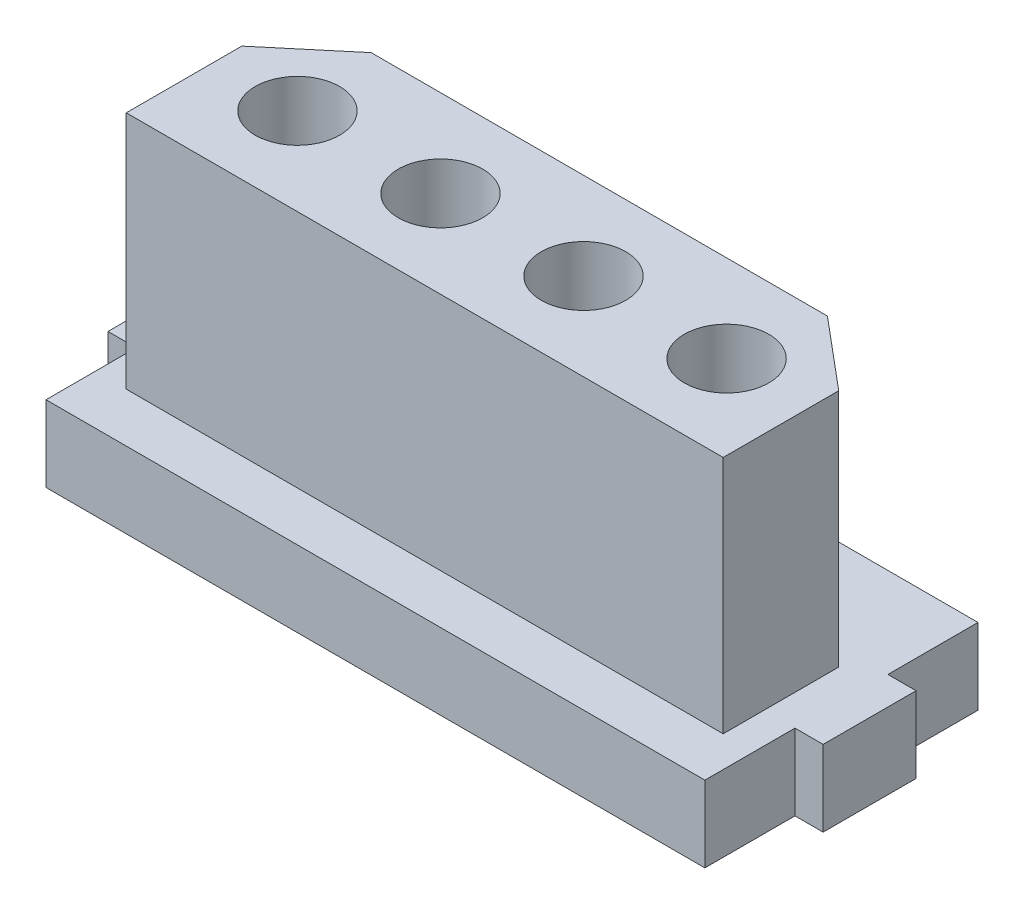
ISO-10303-21;
HEADER;
FILE_DESCRIPTION(('STEP AP214'),'2;1');
FILE_NAME('part.step','',(''),(''),'','','');
FILE_SCHEMA(('AUTOMOTIVE_DESIGN { 1 0 10303 214 1 1 1 1 }'));
ENDSEC;
DATA;
#1=APPLICATION_CONTEXT('core data for automotive mechanical design processes');
#2=APPLICATION_PROTOCOL_DEFINITION('international standard','automotive_design',2000,#1);
#3=PRODUCT_CONTEXT('',#1,'mechanical');
#4=PRODUCT('Part','Part','',(#3));
#5=PRODUCT_RELATED_PRODUCT_CATEGORY('part','',(#4));
#6=PRODUCT_DEFINITION_FORMATION('','',#4);
#7=PRODUCT_DEFINITION_CONTEXT('part definition',#1,'design');
#8=PRODUCT_DEFINITION('design','',#6,#7);
#9=PRODUCT_DEFINITION_SHAPE('','',#8);
#10=(LENGTH_UNIT() NAMED_UNIT(*) SI_UNIT(.MILLI.,.METRE.));
#11=(NAMED_UNIT(*) PLANE_ANGLE_UNIT() SI_UNIT($,.RADIAN.));
#12=(NAMED_UNIT(*) SI_UNIT($,.STERADIAN.) SOLID_ANGLE_UNIT());
#13=UNCERTAINTY_MEASURE_WITH_UNIT(LENGTH_MEASURE(1.E-05),#10,'distance_accuracy_value','');
#14=(GEOMETRIC_REPRESENTATION_CONTEXT(3) GLOBAL_UNCERTAINTY_ASSIGNED_CONTEXT((#13)) GLOBAL_UNIT_ASSIGNED_CONTEXT((#10,
#11,#12)) REPRESENTATION_CONTEXT('',''));
#15=CARTESIAN_POINT('',(0.,0.,0.));
#16=DIRECTION('',(0.,0.,1.));
#17=DIRECTION('',(1.,0.,0.));
#18=AXIS2_PLACEMENT_3D('',#15,#16,#17);
#19=CARTESIAN_POINT('',(0.,2.7,0.));
#20=DIRECTION('',(0.,1.,0.));
#21=DIRECTION('',(0.,0.,1.));
#22=AXIS2_PLACEMENT_3D('',#19,#20,#21);
#23=PLANE('',#22);
#24=CARTESIAN_POINT('',(7.62,2.7,0.));
#25=DIRECTION('',(0.,1.,0.));
#26=DIRECTION('',(0.,0.,1.));
#27=AXIS2_PLACEMENT_3D('',#24,#25,#26);
#28=CIRCLE('',#27,1.5);
#29=CARTESIAN_POINT('',(7.62,2.7,1.5));
#30=VERTEX_POINT('',#29);
#31=EDGE_CURVE('E20',#30,#30,#28,.T.);
#32=ORIENTED_EDGE('',*,*,#31,.T.);
#33=EDGE_LOOP('',(#32));
#34=FACE_BOUND('',#33,.T.);
#35=ADVANCED_FACE('F17',(#34),#23,.T.);
#36=CARTESIAN_POINT('',(0.,2.7,0.));
#37=DIRECTION('',(0.,1.,0.));
#38=DIRECTION('',(0.,0.,1.));
#39=AXIS2_PLACEMENT_3D('',#36,#37,#38);
#40=PLANE('',#39);
#41=CARTESIAN_POINT('',(2.54,2.7,0.));
#42=DIRECTION('',(0.,1.,0.));
#43=DIRECTION('',(0.,0.,1.));
#44=AXIS2_PLACEMENT_3D('',#41,#42,#43);
#45=CIRCLE('',#44,1.5);
#46=CARTESIAN_POINT('',(2.54,2.7,1.5));
#47=VERTEX_POINT('',#46);
#48=EDGE_CURVE('E183',#47,#47,#45,.T.);
#49=ORIENTED_EDGE('',*,*,#48,.T.);
#50=EDGE_LOOP('',(#49));
#51=FACE_BOUND('',#50,.T.);
#52=ADVANCED_FACE('F459',(#51),#40,.T.);
#53=CARTESIAN_POINT('',(0.,2.7,0.));
#54=DIRECTION('',(0.,1.,0.));
#55=DIRECTION('',(0.,0.,1.));
#56=AXIS2_PLACEMENT_3D('',#53,#54,#55);
#57=PLANE('',#56);
#58=CARTESIAN_POINT('',(-2.54,2.7,0.));
#59=DIRECTION('',(0.,1.,0.));
#60=DIRECTION('',(0.,0.,1.));
#61=AXIS2_PLACEMENT_3D('',#58,#59,#60);
#62=CIRCLE('',#61,1.5);
#63=CARTESIAN_POINT('',(-2.54,2.7,1.5));
#64=VERTEX_POINT('',#63);
#65=EDGE_CURVE('E181',#64,#64,#62,.T.);
#66=ORIENTED_EDGE('',*,*,#65,.T.);
#67=EDGE_LOOP('',(#66));
#68=FACE_BOUND('',#67,.T.);
#69=ADVANCED_FACE('F450',(#68),#57,.T.);
#70=CARTESIAN_POINT('',(0.,2.7,0.));
#71=DIRECTION('',(0.,1.,0.));
#72=DIRECTION('',(0.,0.,1.));
#73=AXIS2_PLACEMENT_3D('',#70,#71,#72);
#74=PLANE('',#73);
#75=CARTESIAN_POINT('',(-7.62,2.7,0.));
#76=DIRECTION('',(0.,1.,0.));
#77=DIRECTION('',(0.,0.,1.));
#78=AXIS2_PLACEMENT_3D('',#75,#76,#77);
#79=CIRCLE('',#78,1.5);
#80=CARTESIAN_POINT('',(-7.62,2.7,1.5));
#81=VERTEX_POINT('',#80);
#82=EDGE_CURVE('E178',#81,#81,#79,.T.);
#83=ORIENTED_EDGE('',*,*,#82,.T.);
#84=EDGE_LOOP('',(#83));
#85=FACE_BOUND('',#84,.T.);
#86=ADVANCED_FACE('F195',(#85),#74,.T.);
#87=CARTESIAN_POINT('',(7.62,11.2,0.));
#88=DIRECTION('',(0.,1.,0.));
#89=DIRECTION('',(0.,0.,1.));
#90=AXIS2_PLACEMENT_3D('',#87,#88,#89);
#91=CYLINDRICAL_SURFACE('',#90,1.5);
#92=ORIENTED_EDGE('',*,*,#31,.F.);
#93=EDGE_LOOP('',(#92));
#94=FACE_BOUND('',#93,.T.);
#95=CARTESIAN_POINT('',(7.62,11.2,0.));
#96=DIRECTION('',(0.,1.,0.));
#97=DIRECTION('',(0.,0.,1.));
#98=AXIS2_PLACEMENT_3D('',#95,#96,#97);
#99=CIRCLE('',#98,1.5);
#100=CARTESIAN_POINT('',(7.62,11.2,1.5));
#101=VERTEX_POINT('',#100);
#102=EDGE_CURVE('E175',#101,#101,#99,.F.);
#103=ORIENTED_EDGE('',*,*,#102,.F.);
#104=EDGE_LOOP('',(#103));
#105=FACE_BOUND('',#104,.T.);
#106=ADVANCED_FACE('F191',(#94,#105),#91,.F.);
#107=CARTESIAN_POINT('',(2.54,11.2,0.));
#108=DIRECTION('',(0.,1.,0.));
#109=DIRECTION('',(0.,0.,1.));
#110=AXIS2_PLACEMENT_3D('',#107,#108,#109);
#111=CYLINDRICAL_SURFACE('',#110,1.5);
#112=ORIENTED_EDGE('',*,*,#48,.F.);
#113=EDGE_LOOP('',(#112));
#114=FACE_BOUND('',#113,.T.);
#115=CARTESIAN_POINT('',(2.54,11.2,0.));
#116=DIRECTION('',(0.,1.,0.));
#117=DIRECTION('',(0.,0.,1.));
#118=AXIS2_PLACEMENT_3D('',#115,#116,#117);
#119=CIRCLE('',#118,1.5);
#120=CARTESIAN_POINT('',(2.54,11.2,1.5));
#121=VERTEX_POINT('',#120);
#122=EDGE_CURVE('E172',#121,#121,#119,.F.);
#123=ORIENTED_EDGE('',*,*,#122,.F.);
#124=EDGE_LOOP('',(#123));
#125=FACE_BOUND('',#124,.T.);
#126=ADVANCED_FACE('F194',(#114,#125),#111,.F.);
#127=CARTESIAN_POINT('',(-2.54,11.2,0.));
#128=DIRECTION('',(0.,1.,0.));
#129=DIRECTION('',(0.,0.,1.));
#130=AXIS2_PLACEMENT_3D('',#127,#128,#129);
#131=CYLINDRICAL_SURFACE('',#130,1.5);
#132=ORIENTED_EDGE('',*,*,#65,.F.);
#133=EDGE_LOOP('',(#132));
#134=FACE_BOUND('',#133,.T.);
#135=CARTESIAN_POINT('',(-2.54,11.2,0.));
#136=DIRECTION('',(0.,1.,0.));
#137=DIRECTION('',(0.,0.,1.));
#138=AXIS2_PLACEMENT_3D('',#135,#136,#137);
#139=CIRCLE('',#138,1.5);
#140=CARTESIAN_POINT('',(-2.54,11.2,1.5));
#141=VERTEX_POINT('',#140);
#142=EDGE_CURVE('E169',#141,#141,#139,.F.);
#143=ORIENTED_EDGE('',*,*,#142,.F.);
#144=EDGE_LOOP('',(#143));
#145=FACE_BOUND('',#144,.T.);
#146=ADVANCED_FACE('F209',(#134,#145),#131,.F.);
#147=CARTESIAN_POINT('',(-7.62,11.2,0.));
#148=DIRECTION('',(0.,1.,0.));
#149=DIRECTION('',(0.,0.,1.));
#150=AXIS2_PLACEMENT_3D('',#147,#148,#149);
#151=CYLINDRICAL_SURFACE('',#150,1.5);
#152=ORIENTED_EDGE('',*,*,#82,.F.);
#153=EDGE_LOOP('',(#152));
#154=FACE_BOUND('',#153,.T.);
#155=CARTESIAN_POINT('',(-7.62,11.2,0.));
#156=DIRECTION('',(0.,1.,0.));
#157=DIRECTION('',(0.,0.,1.));
#158=AXIS2_PLACEMENT_3D('',#155,#156,#157);
#159=CIRCLE('',#158,1.5);
#160=CARTESIAN_POINT('',(-7.62,11.2,1.5));
#161=VERTEX_POINT('',#160);
#162=EDGE_CURVE('E155',#161,#161,#159,.F.);
#163=ORIENTED_EDGE('',*,*,#162,.F.);
#164=EDGE_LOOP('',(#163));
#165=FACE_BOUND('',#164,.T.);
#166=ADVANCED_FACE('F200',(#154,#165),#151,.F.);
#167=CARTESIAN_POINT('',(0.,11.2,0.));
#168=DIRECTION('',(0.,1.,0.));
#169=DIRECTION('',(0.,0.,1.));
#170=AXIS2_PLACEMENT_3D('',#167,#168,#169);
#171=PLANE('',#170);
#172=ORIENTED_EDGE('',*,*,#162,.T.);
#173=EDGE_LOOP('',(#172));
#174=FACE_BOUND('',#173,.T.);
#175=ORIENTED_EDGE('',*,*,#142,.T.);
#176=EDGE_LOOP('',(#175));
#177=FACE_BOUND('',#176,.T.);
#178=ORIENTED_EDGE('',*,*,#122,.T.);
#179=EDGE_LOOP('',(#178));
#180=FACE_BOUND('',#179,.T.);
#181=ORIENTED_EDGE('',*,*,#102,.T.);
#182=EDGE_LOOP('',(#181));
#183=FACE_BOUND('',#182,.T.);
#184=DIRECTION('',(0.,0.,1.));
#185=VECTOR('',#184,1.);
#186=CARTESIAN_POINT('',(10.6,11.2,-1.00385));
#187=LINE('',#186,#185);
#188=CARTESIAN_POINT('',(10.6,11.2,3.1));
#189=VERTEX_POINT('',#188);
#190=CARTESIAN_POINT('',(10.6000000000001,11.2,-1.00385000000007));
#191=VERTEX_POINT('',#190);
#192=EDGE_CURVE('E527',#189,#191,#187,.F.);
#193=ORIENTED_EDGE('',*,*,#192,.T.);
#194=DIRECTION('',(0.766044443119007,0.,0.642787609686505));
#195=VECTOR('',#194,1.);
#196=CARTESIAN_POINT('',(8.101905706884,11.2,-3.1));
#197=LINE('',#196,#195);
#198=CARTESIAN_POINT('',(8.101905706884,11.2,-3.1));
#199=VERTEX_POINT('',#198);
#200=EDGE_CURVE('E532',#191,#199,#197,.F.);
#201=ORIENTED_EDGE('',*,*,#200,.T.);
#202=DIRECTION('',(1.,0.,0.));
#203=VECTOR('',#202,1.);
#204=CARTESIAN_POINT('',(-8.101905706884,11.2,-3.1));
#205=LINE('',#204,#203);
#206=CARTESIAN_POINT('',(-8.10190570688394,11.2,-3.09999999999993));
#207=VERTEX_POINT('',#206);
#208=EDGE_CURVE('E536',#199,#207,#205,.F.);
#209=ORIENTED_EDGE('',*,*,#208,.T.);
#210=DIRECTION('',(0.766044443119007,0.,-0.642787609686505));
#211=VECTOR('',#210,1.);
#212=CARTESIAN_POINT('',(-10.6,11.2,-1.00385));
#213=LINE('',#212,#211);
#214=CARTESIAN_POINT('',(-10.6,11.2,-1.00385));
#215=VERTEX_POINT('',#214);
#216=EDGE_CURVE('E159',#207,#215,#213,.F.);
#217=ORIENTED_EDGE('',*,*,#216,.T.);
#218=DIRECTION('',(0.,0.,-1.));
#219=VECTOR('',#218,1.);
#220=CARTESIAN_POINT('',(-10.6,11.2,3.1));
#221=LINE('',#220,#219);
#222=CARTESIAN_POINT('',(-10.6,11.2,3.1));
#223=VERTEX_POINT('',#222);
#224=EDGE_CURVE('E140',#215,#223,#221,.F.);
#225=ORIENTED_EDGE('',*,*,#224,.T.);
#226=DIRECTION('',(-1.,0.,0.));
#227=VECTOR('',#226,1.);
#228=CARTESIAN_POINT('',(10.6,11.2,3.1));
#229=LINE('',#228,#227);
#230=EDGE_CURVE('E147',#223,#189,#229,.F.);
#231=ORIENTED_EDGE('',*,*,#230,.T.);
#232=EDGE_LOOP('',(#193,#201,#209,#217,#225,#231));
#233=FACE_BOUND('',#232,.T.);
#234=ADVANCED_FACE('F162',(#174,#177,#180,#183,#233),#171,.T.);
#235=CARTESIAN_POINT('',(10.6,11.2,3.1));
#236=DIRECTION('',(0.,0.,-1.));
#237=DIRECTION('',(-1.,0.,0.));
#238=AXIS2_PLACEMENT_3D('',#235,#236,#237);
#239=PLANE('',#238);
#240=DIRECTION('',(1.,0.,0.));
#241=VECTOR('',#240,1.);
#242=CARTESIAN_POINT('',(0.,2.7,3.1));
#243=LINE('',#242,#241);
#244=CARTESIAN_POINT('',(10.6,2.7,3.1));
#245=VERTEX_POINT('',#244);
#246=CARTESIAN_POINT('',(-10.6,2.7,3.1));
#247=VERTEX_POINT('',#246);
#248=EDGE_CURVE('E502',#245,#247,#243,.F.);
#249=ORIENTED_EDGE('',*,*,#248,.F.);
#250=DIRECTION('',(0.,1.,0.));
#251=VECTOR('',#250,1.);
#252=CARTESIAN_POINT('',(10.6,11.2,3.1));
#253=LINE('',#252,#251);
#254=EDGE_CURVE('E152',#245,#189,#253,.T.);
#255=ORIENTED_EDGE('',*,*,#254,.T.);
#256=ORIENTED_EDGE('',*,*,#230,.F.);
#257=DIRECTION('',(0.,1.,0.));
#258=VECTOR('',#257,1.);
#259=CARTESIAN_POINT('',(-10.6,11.2,3.1));
#260=LINE('',#259,#258);
#261=EDGE_CURVE('E150',#223,#247,#260,.F.);
#262=ORIENTED_EDGE('',*,*,#261,.T.);
#263=EDGE_LOOP('',(#249,#255,#256,#262));
#264=FACE_BOUND('',#263,.T.);
#265=ADVANCED_FACE('F149',(#264),#239,.F.);
#266=CARTESIAN_POINT('',(-10.6,11.2,3.1));
#267=DIRECTION('',(1.,0.,0.));
#268=DIRECTION('',(0.,0.,-1.));
#269=AXIS2_PLACEMENT_3D('',#266,#267,#268);
#270=PLANE('',#269);
#271=DIRECTION('',(0.,0.,1.));
#272=VECTOR('',#271,1.);
#273=CARTESIAN_POINT('',(-10.6,2.7,0.));
#274=LINE('',#273,#272);
#275=CARTESIAN_POINT('',(-10.6,2.7,-1.00385));
#276=VERTEX_POINT('',#275);
#277=EDGE_CURVE('E158',#247,#276,#274,.F.);
#278=ORIENTED_EDGE('',*,*,#277,.F.);
#279=ORIENTED_EDGE('',*,*,#261,.F.);
#280=ORIENTED_EDGE('',*,*,#224,.F.);
#281=DIRECTION('',(0.,1.,0.));
#282=VECTOR('',#281,1.);
#283=CARTESIAN_POINT('',(-10.6,11.2,-1.00385));
#284=LINE('',#283,#282);
#285=EDGE_CURVE('E494',#215,#276,#284,.F.);
#286=ORIENTED_EDGE('',*,*,#285,.T.);
#287=EDGE_LOOP('',(#278,#279,#280,#286));
#288=FACE_BOUND('',#287,.T.);
#289=ADVANCED_FACE('F157',(#288),#270,.F.);
#290=CARTESIAN_POINT('',(-10.6,11.2,-1.00385));
#291=DIRECTION('',(0.642787609686505,0.,0.766044443119007));
#292=DIRECTION('',(0.766044443119007,0.,-0.642787609686505));
#293=AXIS2_PLACEMENT_3D('',#290,#291,#292);
#294=PLANE('',#293);
#295=DIRECTION('',(0.766044443118933,0.,-0.642787609686593));
#296=VECTOR('',#295,1.);
#297=CARTESIAN_POINT('',(-10.6,2.7,-1.00385));
#298=LINE('',#297,#296);
#299=CARTESIAN_POINT('',(-8.10190570688388,2.7,-3.09999999999986));
#300=VERTEX_POINT('',#299);
#301=EDGE_CURVE('E493',#276,#300,#298,.T.);
#302=ORIENTED_EDGE('',*,*,#301,.F.);
#303=ORIENTED_EDGE('',*,*,#285,.F.);
#304=ORIENTED_EDGE('',*,*,#216,.F.);
#305=DIRECTION('',(0.,1.,0.));
#306=VECTOR('',#305,1.);
#307=CARTESIAN_POINT('',(-8.101905706884,11.2,-3.1));
#308=LINE('',#307,#306);
#309=EDGE_CURVE('E496',#207,#300,#308,.F.);
#310=ORIENTED_EDGE('',*,*,#309,.T.);
#311=EDGE_LOOP('',(#302,#303,#304,#310));
#312=FACE_BOUND('',#311,.T.);
#313=ADVANCED_FACE('F283',(#312),#294,.F.);
#314=CARTESIAN_POINT('',(-8.101905706884,11.2,-3.1));
#315=DIRECTION('',(0.,0.,1.));
#316=DIRECTION('',(1.,0.,0.));
#317=AXIS2_PLACEMENT_3D('',#314,#315,#316);
#318=PLANE('',#317);
#319=DIRECTION('',(1.,0.,0.));
#320=VECTOR('',#319,1.);
#321=CARTESIAN_POINT('',(0.,2.7,-3.1));
#322=LINE('',#321,#320);
#323=CARTESIAN_POINT('',(8.101905706884,2.7,-3.1));
#324=VERTEX_POINT('',#323);
#325=EDGE_CURVE('E498',#300,#324,#322,.T.);
#326=ORIENTED_EDGE('',*,*,#325,.F.);
#327=ORIENTED_EDGE('',*,*,#309,.F.);
#328=ORIENTED_EDGE('',*,*,#208,.F.);
#329=DIRECTION('',(0.,1.,0.));
#330=VECTOR('',#329,1.);
#331=CARTESIAN_POINT('',(8.101905706884,11.2,-3.1));
#332=LINE('',#331,#330);
#333=EDGE_CURVE('E529',#199,#324,#332,.F.);
#334=ORIENTED_EDGE('',*,*,#333,.T.);
#335=EDGE_LOOP('',(#326,#327,#328,#334));
#336=FACE_BOUND('',#335,.T.);
#337=ADVANCED_FACE('F279',(#336),#318,.F.);
#338=CARTESIAN_POINT('',(8.101905706884,11.2,-3.1));
#339=DIRECTION('',(-0.642787609686505,0.,0.766044443119007));
#340=DIRECTION('',(0.766044443119007,0.,0.642787609686505));
#341=AXIS2_PLACEMENT_3D('',#338,#339,#340);
#342=PLANE('',#341);
#343=DIRECTION('',(0.766044443118933,0.,0.642787609686593));
#344=VECTOR('',#343,1.);
#345=CARTESIAN_POINT('',(8.101905706884,2.7,-3.1));
#346=LINE('',#345,#344);
#347=CARTESIAN_POINT('',(10.6000000000001,2.7,-1.00385000000014));
#348=VERTEX_POINT('',#347);
#349=EDGE_CURVE('E500',#324,#348,#346,.T.);
#350=ORIENTED_EDGE('',*,*,#349,.F.);
#351=ORIENTED_EDGE('',*,*,#333,.F.);
#352=ORIENTED_EDGE('',*,*,#200,.F.);
#353=DIRECTION('',(0.,1.,0.));
#354=VECTOR('',#353,1.);
#355=CARTESIAN_POINT('',(10.6,11.2,-1.00385));
#356=LINE('',#355,#354);
#357=EDGE_CURVE('E524',#191,#348,#356,.F.);
#358=ORIENTED_EDGE('',*,*,#357,.T.);
#359=EDGE_LOOP('',(#350,#351,#352,#358));
#360=FACE_BOUND('',#359,.T.);
#361=ADVANCED_FACE('F275',(#360),#342,.F.);
#362=CARTESIAN_POINT('',(10.6,11.2,-1.00385));
#363=DIRECTION('',(-1.,0.,0.));
#364=DIRECTION('',(0.,0.,1.));
#365=AXIS2_PLACEMENT_3D('',#362,#363,#364);
#366=PLANE('',#365);
#367=DIRECTION('',(0.,0.,1.));
#368=VECTOR('',#367,1.);
#369=CARTESIAN_POINT('',(10.6,2.7,0.));
#370=LINE('',#369,#368);
#371=EDGE_CURVE('E543',#348,#245,#370,.T.);
#372=ORIENTED_EDGE('',*,*,#371,.F.);
#373=ORIENTED_EDGE('',*,*,#357,.F.);
#374=ORIENTED_EDGE('',*,*,#192,.F.);
#375=ORIENTED_EDGE('',*,*,#254,.F.);
#376=EDGE_LOOP('',(#372,#373,#374,#375));
#377=FACE_BOUND('',#376,.T.);
#378=ADVANCED_FACE('F271',(#377),#366,.F.);
#379=CARTESIAN_POINT('',(-11.7,0.,-1.65));
#380=DIRECTION('',(0.,0.,-1.));
#381=DIRECTION('',(-1.,0.,0.));
#382=AXIS2_PLACEMENT_3D('',#379,#380,#381);
#383=PLANE('',#382);
#384=DIRECTION('',(1.,0.,0.));
#385=VECTOR('',#384,1.);
#386=CARTESIAN_POINT('',(0.,2.7,-1.65));
#387=LINE('',#386,#385);
#388=CARTESIAN_POINT('',(-11.7,2.7,-1.65));
#389=VERTEX_POINT('',#388);
#390=CARTESIAN_POINT('',(-12.7,2.7,-1.65));
#391=VERTEX_POINT('',#390);
#392=EDGE_CURVE('E513',#389,#391,#387,.F.);
#393=ORIENTED_EDGE('',*,*,#392,.F.);
#394=DIRECTION('',(0.,1.,0.));
#395=VECTOR('',#394,1.);
#396=CARTESIAN_POINT('',(-11.7,0.,-1.65));
#397=LINE('',#396,#395);
#398=CARTESIAN_POINT('',(-11.7,0.,-1.65));
#399=VERTEX_POINT('',#398);
#400=EDGE_CURVE('E548',#399,#389,#397,.T.);
#401=ORIENTED_EDGE('',*,*,#400,.F.);
#402=DIRECTION('',(-1.,0.,0.));
#403=VECTOR('',#402,1.);
#404=CARTESIAN_POINT('',(-11.7,0.,-1.65));
#405=LINE('',#404,#403);
#406=CARTESIAN_POINT('',(-12.7,0.,-1.65));
#407=VERTEX_POINT('',#406);
#408=EDGE_CURVE('E521',#399,#407,#405,.T.);
#409=ORIENTED_EDGE('',*,*,#408,.T.);
#410=DIRECTION('',(0.,1.,0.));
#411=VECTOR('',#410,1.);
#412=CARTESIAN_POINT('',(-12.7,0.,-1.65));
#413=LINE('',#412,#411);
#414=EDGE_CURVE('E556',#391,#407,#413,.F.);
#415=ORIENTED_EDGE('',*,*,#414,.F.);
#416=EDGE_LOOP('',(#393,#401,#409,#415));
#417=FACE_BOUND('',#416,.T.);
#418=ADVANCED_FACE('F267',(#417),#383,.T.);
#419=CARTESIAN_POINT('',(-12.7,0.,1.65));
#420=DIRECTION('',(0.,0.,1.));
#421=DIRECTION('',(1.,0.,0.));
#422=AXIS2_PLACEMENT_3D('',#419,#420,#421);
#423=PLANE('',#422);
#424=DIRECTION('',(1.,0.,0.));
#425=VECTOR('',#424,1.);
#426=CARTESIAN_POINT('',(-12.7,0.,1.65));
#427=LINE('',#426,#425);
#428=CARTESIAN_POINT('',(-12.7,0.,1.65));
#429=VERTEX_POINT('',#428);
#430=CARTESIAN_POINT('',(-11.7,0.,1.65));
#431=VERTEX_POINT('',#430);
#432=EDGE_CURVE('E519',#429,#431,#427,.T.);
#433=ORIENTED_EDGE('',*,*,#432,.T.);
#434=DIRECTION('',(0.,1.,0.));
#435=VECTOR('',#434,1.);
#436=CARTESIAN_POINT('',(-11.7,0.,1.65));
#437=LINE('',#436,#435);
#438=CARTESIAN_POINT('',(-11.7,2.7,1.65));
#439=VERTEX_POINT('',#438);
#440=EDGE_CURVE('E562',#439,#431,#437,.F.);
#441=ORIENTED_EDGE('',*,*,#440,.F.);
#442=DIRECTION('',(1.,0.,0.));
#443=VECTOR('',#442,1.);
#444=CARTESIAN_POINT('',(0.,2.7,1.65));
#445=LINE('',#444,#443);
#446=CARTESIAN_POINT('',(-12.7,2.7,1.65));
#447=VERTEX_POINT('',#446);
#448=EDGE_CURVE('E511',#447,#439,#445,.T.);
#449=ORIENTED_EDGE('',*,*,#448,.F.);
#450=DIRECTION('',(0.,1.,0.));
#451=VECTOR('',#450,1.);
#452=CARTESIAN_POINT('',(-12.7,0.,1.65));
#453=LINE('',#452,#451);
#454=EDGE_CURVE('E551',#429,#447,#453,.T.);
#455=ORIENTED_EDGE('',*,*,#454,.F.);
#456=EDGE_LOOP('',(#433,#441,#449,#455));
#457=FACE_BOUND('',#456,.T.);
#458=ADVANCED_FACE('F263',(#457),#423,.T.);
#459=CARTESIAN_POINT('',(11.7,0.,1.65));
#460=DIRECTION('',(0.,0.,1.));
#461=DIRECTION('',(1.,0.,0.));
#462=AXIS2_PLACEMENT_3D('',#459,#460,#461);
#463=PLANE('',#462);
#464=DIRECTION('',(1.,0.,0.));
#465=VECTOR('',#464,1.);
#466=CARTESIAN_POINT('',(0.,2.7,1.65));
#467=LINE('',#466,#465);
#468=CARTESIAN_POINT('',(11.7,2.7,1.65));
#469=VERTEX_POINT('',#468);
#470=CARTESIAN_POINT('',(12.7,2.7,1.65));
#471=VERTEX_POINT('',#470);
#472=EDGE_CURVE('E509',#469,#471,#467,.T.);
#473=ORIENTED_EDGE('',*,*,#472,.F.);
#474=DIRECTION('',(0.,1.,0.));
#475=VECTOR('',#474,1.);
#476=CARTESIAN_POINT('',(11.7,0.,1.65));
#477=LINE('',#476,#475);
#478=CARTESIAN_POINT('',(11.7,0.,1.65));
#479=VERTEX_POINT('',#478);
#480=EDGE_CURVE('E574',#479,#469,#477,.T.);
#481=ORIENTED_EDGE('',*,*,#480,.F.);
#482=DIRECTION('',(1.,0.,0.));
#483=VECTOR('',#482,1.);
#484=CARTESIAN_POINT('',(11.7,0.,1.65));
#485=LINE('',#484,#483);
#486=CARTESIAN_POINT('',(12.7,0.,1.65));
#487=VERTEX_POINT('',#486);
#488=EDGE_CURVE('E517',#479,#487,#485,.T.);
#489=ORIENTED_EDGE('',*,*,#488,.T.);
#490=DIRECTION('',(0.,1.,0.));
#491=VECTOR('',#490,1.);
#492=CARTESIAN_POINT('',(12.7,0.,1.65));
#493=LINE('',#492,#491);
#494=EDGE_CURVE('E582',#471,#487,#493,.F.);
#495=ORIENTED_EDGE('',*,*,#494,.F.);
#496=EDGE_LOOP('',(#473,#481,#489,#495));
#497=FACE_BOUND('',#496,.T.);
#498=ADVANCED_FACE('F259',(#497),#463,.T.);
#499=CARTESIAN_POINT('',(12.7,0.,-1.65));
#500=DIRECTION('',(0.,0.,-1.));
#501=DIRECTION('',(-1.,0.,0.));
#502=AXIS2_PLACEMENT_3D('',#499,#500,#501);
#503=PLANE('',#502);
#504=DIRECTION('',(-1.,0.,0.));
#505=VECTOR('',#504,1.);
#506=CARTESIAN_POINT('',(12.7,0.,-1.65));
#507=LINE('',#506,#505);
#508=CARTESIAN_POINT('',(12.7,0.,-1.65));
#509=VERTEX_POINT('',#508);
#510=CARTESIAN_POINT('',(11.7,0.,-1.65));
#511=VERTEX_POINT('',#510);
#512=EDGE_CURVE('E515',#509,#511,#507,.T.);
#513=ORIENTED_EDGE('',*,*,#512,.T.);
#514=DIRECTION('',(0.,1.,0.));
#515=VECTOR('',#514,1.);
#516=CARTESIAN_POINT('',(11.7,0.,-1.65));
#517=LINE('',#516,#515);
#518=CARTESIAN_POINT('',(11.7,2.7,-1.65));
#519=VERTEX_POINT('',#518);
#520=EDGE_CURVE('E588',#519,#511,#517,.F.);
#521=ORIENTED_EDGE('',*,*,#520,.F.);
#522=DIRECTION('',(1.,0.,0.));
#523=VECTOR('',#522,1.);
#524=CARTESIAN_POINT('',(0.,2.7,-1.65));
#525=LINE('',#524,#523);
#526=CARTESIAN_POINT('',(12.7,2.7,-1.65));
#527=VERTEX_POINT('',#526);
#528=EDGE_CURVE('E507',#527,#519,#525,.F.);
#529=ORIENTED_EDGE('',*,*,#528,.F.);
#530=DIRECTION('',(0.,1.,0.));
#531=VECTOR('',#530,1.);
#532=CARTESIAN_POINT('',(12.7,0.,-1.65));
#533=LINE('',#532,#531);
#534=EDGE_CURVE('E577',#509,#527,#533,.T.);
#535=ORIENTED_EDGE('',*,*,#534,.F.);
#536=EDGE_LOOP('',(#513,#521,#529,#535));
#537=FACE_BOUND('',#536,.T.);
#538=ADVANCED_FACE('F255',(#537),#503,.T.);
#539=CARTESIAN_POINT('',(0.,2.7,0.));
#540=DIRECTION('',(0.,1.,0.));
#541=DIRECTION('',(0.,0.,1.));
#542=AXIS2_PLACEMENT_3D('',#539,#540,#541);
#543=PLANE('',#542);
#544=ORIENTED_EDGE('',*,*,#349,.T.);
#545=ORIENTED_EDGE('',*,*,#371,.T.);
#546=ORIENTED_EDGE('',*,*,#248,.T.);
#547=ORIENTED_EDGE('',*,*,#277,.T.);
#548=ORIENTED_EDGE('',*,*,#301,.T.);
#549=ORIENTED_EDGE('',*,*,#325,.T.);
#550=EDGE_LOOP('',(#544,#545,#546,#547,#548,#549));
#551=FACE_BOUND('',#550,.T.);
#552=ORIENTED_EDGE('',*,*,#528,.T.);
#553=DIRECTION('',(0.,0.,-1.));
#554=VECTOR('',#553,1.);
#555=CARTESIAN_POINT('',(11.7,2.7,4.85));
#556=LINE('',#555,#554);
#557=CARTESIAN_POINT('',(11.7,2.7,-4.85));
#558=VERTEX_POINT('',#557);
#559=EDGE_CURVE('E585',#558,#519,#556,.F.);
#560=ORIENTED_EDGE('',*,*,#559,.F.);
#561=DIRECTION('',(-1.,0.,0.));
#562=VECTOR('',#561,1.);
#563=CARTESIAN_POINT('',(11.7,2.7,-4.85));
#564=LINE('',#563,#562);
#565=CARTESIAN_POINT('',(-11.7,2.7,-4.85));
#566=VERTEX_POINT('',#565);
#567=EDGE_CURVE('E595',#566,#558,#564,.F.);
#568=ORIENTED_EDGE('',*,*,#567,.F.);
#569=DIRECTION('',(0.,0.,1.));
#570=VECTOR('',#569,1.);
#571=CARTESIAN_POINT('',(-11.7,2.7,-4.85));
#572=LINE('',#571,#570);
#573=EDGE_CURVE('E544',#389,#566,#572,.F.);
#574=ORIENTED_EDGE('',*,*,#573,.F.);
#575=ORIENTED_EDGE('',*,*,#392,.T.);
#576=DIRECTION('',(0.,0.,1.));
#577=VECTOR('',#576,1.);
#578=CARTESIAN_POINT('',(-12.7,2.7,-1.65));
#579=LINE('',#578,#577);
#580=EDGE_CURVE('E553',#447,#391,#579,.F.);
#581=ORIENTED_EDGE('',*,*,#580,.F.);
#582=ORIENTED_EDGE('',*,*,#448,.T.);
#583=DIRECTION('',(0.,0.,1.));
#584=VECTOR('',#583,1.);
#585=CARTESIAN_POINT('',(-11.7,2.7,-4.85));
#586=LINE('',#585,#584);
#587=CARTESIAN_POINT('',(-11.7,2.7,4.85));
#588=VERTEX_POINT('',#587);
#589=EDGE_CURVE('E559',#588,#439,#586,.F.);
#590=ORIENTED_EDGE('',*,*,#589,.F.);
#591=DIRECTION('',(1.,0.,0.));
#592=VECTOR('',#591,1.);
#593=CARTESIAN_POINT('',(-11.7,2.7,4.85));
#594=LINE('',#593,#592);
#595=CARTESIAN_POINT('',(11.7,2.7,4.85));
#596=VERTEX_POINT('',#595);
#597=EDGE_CURVE('E567',#596,#588,#594,.F.);
#598=ORIENTED_EDGE('',*,*,#597,.F.);
#599=DIRECTION('',(0.,0.,-1.));
#600=VECTOR('',#599,1.);
#601=CARTESIAN_POINT('',(11.7,2.7,4.85));
#602=LINE('',#601,#600);
#603=EDGE_CURVE('E570',#469,#596,#602,.F.);
#604=ORIENTED_EDGE('',*,*,#603,.F.);
#605=ORIENTED_EDGE('',*,*,#472,.T.);
#606=DIRECTION('',(0.,0.,-1.));
#607=VECTOR('',#606,1.);
#608=CARTESIAN_POINT('',(12.7,2.7,1.65));
#609=LINE('',#608,#607);
#610=EDGE_CURVE('E579',#527,#471,#609,.F.);
#611=ORIENTED_EDGE('',*,*,#610,.F.);
#612=EDGE_LOOP('',(#552,#560,#568,#574,#575,#581,#582,#590,#598,#604,#605,#611));
#613=FACE_BOUND('',#612,.T.);
#614=ADVANCED_FACE('F251',(#551,#613),#543,.T.);
#615=CARTESIAN_POINT('',(-11.7,0.,-4.85));
#616=DIRECTION('',(-1.,0.,0.));
#617=DIRECTION('',(0.,0.,1.));
#618=AXIS2_PLACEMENT_3D('',#615,#616,#617);
#619=PLANE('',#618);
#620=DIRECTION('',(0.,0.,1.));
#621=VECTOR('',#620,1.);
#622=CARTESIAN_POINT('',(-11.7,0.,0.));
#623=LINE('',#622,#621);
#624=CARTESIAN_POINT('',(-11.7,0.,-4.85));
#625=VERTEX_POINT('',#624);
#626=EDGE_CURVE('E597',#625,#399,#623,.T.);
#627=ORIENTED_EDGE('',*,*,#626,.T.);
#628=ORIENTED_EDGE('',*,*,#400,.T.);
#629=ORIENTED_EDGE('',*,*,#573,.T.);
#630=DIRECTION('',(0.,1.,0.));
#631=VECTOR('',#630,1.);
#632=CARTESIAN_POINT('',(-11.7,0.,-4.85));
#633=LINE('',#632,#631);
#634=EDGE_CURVE('E592',#625,#566,#633,.T.);
#635=ORIENTED_EDGE('',*,*,#634,.F.);
#636=EDGE_LOOP('',(#627,#628,#629,#635));
#637=FACE_BOUND('',#636,.T.);
#638=ADVANCED_FACE('F247',(#637),#619,.T.);
#639=CARTESIAN_POINT('',(-12.7,0.,-1.65));
#640=DIRECTION('',(-1.,0.,0.));
#641=DIRECTION('',(0.,0.,1.));
#642=AXIS2_PLACEMENT_3D('',#639,#640,#641);
#643=PLANE('',#642);
#644=ORIENTED_EDGE('',*,*,#414,.T.);
#645=DIRECTION('',(0.,0.,1.));
#646=VECTOR('',#645,1.);
#647=CARTESIAN_POINT('',(-12.7,0.,0.));
#648=LINE('',#647,#646);
#649=EDGE_CURVE('E600',#407,#429,#648,.T.);
#650=ORIENTED_EDGE('',*,*,#649,.T.);
#651=ORIENTED_EDGE('',*,*,#454,.T.);
#652=ORIENTED_EDGE('',*,*,#580,.T.);
#653=EDGE_LOOP('',(#644,#650,#651,#652));
#654=FACE_BOUND('',#653,.T.);
#655=ADVANCED_FACE('F243',(#654),#643,.T.);
#656=CARTESIAN_POINT('',(-11.7,0.,-4.85));
#657=DIRECTION('',(-1.,0.,0.));
#658=DIRECTION('',(0.,0.,1.));
#659=AXIS2_PLACEMENT_3D('',#656,#657,#658);
#660=PLANE('',#659);
#661=ORIENTED_EDGE('',*,*,#589,.T.);
#662=ORIENTED_EDGE('',*,*,#440,.T.);
#663=DIRECTION('',(0.,0.,1.));
#664=VECTOR('',#663,1.);
#665=CARTESIAN_POINT('',(-11.7,0.,0.));
#666=LINE('',#665,#664);
#667=CARTESIAN_POINT('',(-11.7,0.,4.85));
#668=VERTEX_POINT('',#667);
#669=EDGE_CURVE('E603',#431,#668,#666,.T.);
#670=ORIENTED_EDGE('',*,*,#669,.T.);
#671=DIRECTION('',(0.,1.,0.));
#672=VECTOR('',#671,1.);
#673=CARTESIAN_POINT('',(-11.7,0.,4.85));
#674=LINE('',#673,#672);
#675=EDGE_CURVE('E565',#588,#668,#674,.F.);
#676=ORIENTED_EDGE('',*,*,#675,.F.);
#677=EDGE_LOOP('',(#661,#662,#670,#676));
#678=FACE_BOUND('',#677,.T.);
#679=ADVANCED_FACE('F239',(#678),#660,.T.);
#680=CARTESIAN_POINT('',(-11.7,0.,4.85));
#681=DIRECTION('',(0.,0.,1.));
#682=DIRECTION('',(1.,0.,0.));
#683=AXIS2_PLACEMENT_3D('',#680,#681,#682);
#684=PLANE('',#683);
#685=DIRECTION('',(0.,1.,0.));
#686=VECTOR('',#685,1.);
#687=CARTESIAN_POINT('',(11.7,0.,4.85));
#688=LINE('',#687,#686);
#689=CARTESIAN_POINT('',(11.7,0.,4.85));
#690=VERTEX_POINT('',#689);
#691=EDGE_CURVE('E572',#596,#690,#688,.F.);
#692=ORIENTED_EDGE('',*,*,#691,.F.);
#693=ORIENTED_EDGE('',*,*,#597,.T.);
#694=ORIENTED_EDGE('',*,*,#675,.T.);
#695=DIRECTION('',(1.,0.,0.));
#696=VECTOR('',#695,1.);
#697=CARTESIAN_POINT('',(0.,0.,4.85));
#698=LINE('',#697,#696);
#699=EDGE_CURVE('E606',#668,#690,#698,.T.);
#700=ORIENTED_EDGE('',*,*,#699,.T.);
#701=EDGE_LOOP('',(#692,#693,#694,#700));
#702=FACE_BOUND('',#701,.T.);
#703=ADVANCED_FACE('F235',(#702),#684,.T.);
#704=CARTESIAN_POINT('',(11.7,0.,4.85));
#705=DIRECTION('',(1.,0.,0.));
#706=DIRECTION('',(0.,0.,-1.));
#707=AXIS2_PLACEMENT_3D('',#704,#705,#706);
#708=PLANE('',#707);
#709=DIRECTION('',(0.,0.,1.));
#710=VECTOR('',#709,1.);
#711=CARTESIAN_POINT('',(11.7,0.,0.));
#712=LINE('',#711,#710);
#713=EDGE_CURVE('E609',#690,#479,#712,.F.);
#714=ORIENTED_EDGE('',*,*,#713,.T.);
#715=ORIENTED_EDGE('',*,*,#480,.T.);
#716=ORIENTED_EDGE('',*,*,#603,.T.);
#717=ORIENTED_EDGE('',*,*,#691,.T.);
#718=EDGE_LOOP('',(#714,#715,#716,#717));
#719=FACE_BOUND('',#718,.T.);
#720=ADVANCED_FACE('F231',(#719),#708,.T.);
#721=CARTESIAN_POINT('',(12.7,0.,1.65));
#722=DIRECTION('',(1.,0.,0.));
#723=DIRECTION('',(0.,0.,-1.));
#724=AXIS2_PLACEMENT_3D('',#721,#722,#723);
#725=PLANE('',#724);
#726=ORIENTED_EDGE('',*,*,#494,.T.);
#727=DIRECTION('',(0.,0.,1.));
#728=VECTOR('',#727,1.);
#729=CARTESIAN_POINT('',(12.7,0.,0.));
#730=LINE('',#729,#728);
#731=EDGE_CURVE('E612',#487,#509,#730,.F.);
#732=ORIENTED_EDGE('',*,*,#731,.T.);
#733=ORIENTED_EDGE('',*,*,#534,.T.);
#734=ORIENTED_EDGE('',*,*,#610,.T.);
#735=EDGE_LOOP('',(#726,#732,#733,#734));
#736=FACE_BOUND('',#735,.T.);
#737=ADVANCED_FACE('F227',(#736),#725,.T.);
#738=CARTESIAN_POINT('',(11.7,0.,4.85));
#739=DIRECTION('',(1.,0.,0.));
#740=DIRECTION('',(0.,0.,-1.));
#741=AXIS2_PLACEMENT_3D('',#738,#739,#740);
#742=PLANE('',#741);
#743=ORIENTED_EDGE('',*,*,#559,.T.);
#744=ORIENTED_EDGE('',*,*,#520,.T.);
#745=DIRECTION('',(0.,0.,1.));
#746=VECTOR('',#745,1.);
#747=CARTESIAN_POINT('',(11.7,0.,0.));
#748=LINE('',#747,#746);
#749=CARTESIAN_POINT('',(11.7,0.,-4.85));
#750=VERTEX_POINT('',#749);
#751=EDGE_CURVE('E26',#511,#750,#748,.F.);
#752=ORIENTED_EDGE('',*,*,#751,.T.);
#753=DIRECTION('',(0.,1.,0.));
#754=VECTOR('',#753,1.);
#755=CARTESIAN_POINT('',(11.7,0.,-4.85));
#756=LINE('',#755,#754);
#757=EDGE_CURVE('E34',#558,#750,#756,.F.);
#758=ORIENTED_EDGE('',*,*,#757,.F.);
#759=EDGE_LOOP('',(#743,#744,#752,#758));
#760=FACE_BOUND('',#759,.T.);
#761=ADVANCED_FACE('F221',(#760),#742,.T.);
#762=CARTESIAN_POINT('',(11.7,0.,-4.85));
#763=DIRECTION('',(0.,0.,-1.));
#764=DIRECTION('',(-1.,0.,0.));
#765=AXIS2_PLACEMENT_3D('',#762,#763,#764);
#766=PLANE('',#765);
#767=ORIENTED_EDGE('',*,*,#634,.T.);
#768=ORIENTED_EDGE('',*,*,#567,.T.);
#769=ORIENTED_EDGE('',*,*,#757,.T.);
#770=DIRECTION('',(1.,0.,0.));
#771=VECTOR('',#770,1.);
#772=CARTESIAN_POINT('',(0.,0.,-4.85));
#773=LINE('',#772,#771);
#774=EDGE_CURVE('E11',#750,#625,#773,.F.);
#775=ORIENTED_EDGE('',*,*,#774,.T.);
#776=EDGE_LOOP('',(#767,#768,#769,#775));
#777=FACE_BOUND('',#776,.T.);
#778=ADVANCED_FACE('F215',(#777),#766,.T.);
#779=CARTESIAN_POINT('',(0.,0.,0.));
#780=DIRECTION('',(0.,1.,0.));
#781=DIRECTION('',(0.,0.,1.));
#782=AXIS2_PLACEMENT_3D('',#779,#780,#781);
#783=PLANE('',#782);
#784=ORIENTED_EDGE('',*,*,#751,.F.);
#785=ORIENTED_EDGE('',*,*,#512,.F.);
#786=ORIENTED_EDGE('',*,*,#731,.F.);
#787=ORIENTED_EDGE('',*,*,#488,.F.);
#788=ORIENTED_EDGE('',*,*,#713,.F.);
#789=ORIENTED_EDGE('',*,*,#699,.F.);
#790=ORIENTED_EDGE('',*,*,#669,.F.);
#791=ORIENTED_EDGE('',*,*,#432,.F.);
#792=ORIENTED_EDGE('',*,*,#649,.F.);
#793=ORIENTED_EDGE('',*,*,#408,.F.);
#794=ORIENTED_EDGE('',*,*,#626,.F.);
#795=ORIENTED_EDGE('',*,*,#774,.F.);
#796=EDGE_LOOP('',(#784,#785,#786,#787,#788,#789,#790,#791,#792,#793,#794,#795));
#797=FACE_BOUND('',#796,.T.);
#798=ADVANCED_FACE('F213',(#797),#783,.F.);
#799=CLOSED_SHELL('',(#35,#52,#69,#86,#106,#126,#146,#166,#234,#265,#289,#313,#337,#361,#378,
#418,#458,#498,#538,#614,#638,#655,#679,#703,#720,#737,#761,#778,#798));
#800=MANIFOLD_SOLID_BREP('B1',#799);
#801=ADVANCED_BREP_SHAPE_REPRESENTATION('',(#18,#800),#14);
#802=SHAPE_DEFINITION_REPRESENTATION(#9,#801);
ENDSEC;
END-ISO-10303-21;
